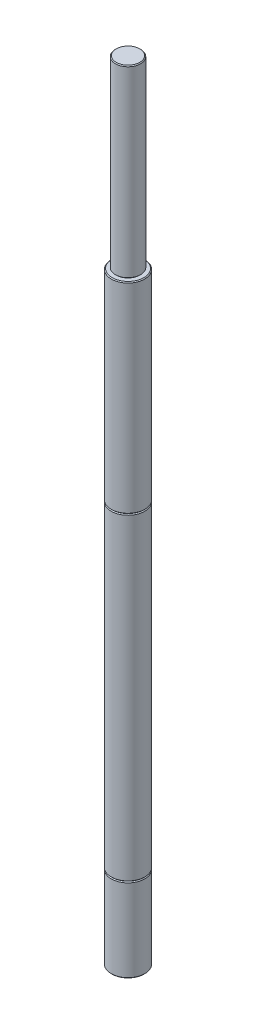
ISO-10303-21;
HEADER;
FILE_DESCRIPTION(('STEP AP214'),'2;1');
FILE_NAME('part.step','',(''),(''),'','','');
FILE_SCHEMA(('AUTOMOTIVE_DESIGN { 1 0 10303 214 1 1 1 1 }'));
ENDSEC;
DATA;
#1=APPLICATION_CONTEXT('core data for automotive mechanical design processes');
#2=APPLICATION_PROTOCOL_DEFINITION('international standard','automotive_design',2000,#1);
#3=PRODUCT_CONTEXT('',#1,'mechanical');
#4=PRODUCT('Part','Part','',(#3));
#5=PRODUCT_RELATED_PRODUCT_CATEGORY('part','',(#4));
#6=PRODUCT_DEFINITION_FORMATION('','',#4);
#7=PRODUCT_DEFINITION_CONTEXT('part definition',#1,'design');
#8=PRODUCT_DEFINITION('design','',#6,#7);
#9=PRODUCT_DEFINITION_SHAPE('','',#8);
#10=(LENGTH_UNIT() NAMED_UNIT(*) SI_UNIT(.MILLI.,.METRE.));
#11=(NAMED_UNIT(*) PLANE_ANGLE_UNIT() SI_UNIT($,.RADIAN.));
#12=(NAMED_UNIT(*) SI_UNIT($,.STERADIAN.) SOLID_ANGLE_UNIT());
#13=UNCERTAINTY_MEASURE_WITH_UNIT(LENGTH_MEASURE(1.E-05),#10,'distance_accuracy_value','');
#14=(GEOMETRIC_REPRESENTATION_CONTEXT(3) GLOBAL_UNCERTAINTY_ASSIGNED_CONTEXT((#13)) GLOBAL_UNIT_ASSIGNED_CONTEXT((#10,
#11,#12)) REPRESENTATION_CONTEXT('',''));
#15=CARTESIAN_POINT('',(0.,0.,0.));
#16=DIRECTION('',(0.,0.,1.));
#17=DIRECTION('',(1.,0.,0.));
#18=AXIS2_PLACEMENT_3D('',#15,#16,#17);
#19=CARTESIAN_POINT('',(0.,-72.,0.));
#20=DIRECTION('',(0.,1.,0.));
#21=DIRECTION('',(0.,0.,1.));
#22=AXIS2_PLACEMENT_3D('',#19,#20,#21);
#23=CYLINDRICAL_SURFACE('',#22,2.);
#24=CARTESIAN_POINT('',(0.,-62.1,0.));
#25=DIRECTION('',(0.,-1.,0.));
#26=DIRECTION('',(0.,0.,-1.));
#27=AXIS2_PLACEMENT_3D('',#24,#25,#26);
#28=CIRCLE('',#27,2.);
#29=CARTESIAN_POINT('',(0.,-62.1,-2.));
#30=VERTEX_POINT('',#29);
#31=EDGE_CURVE('E64',#30,#30,#28,.T.);
#32=ORIENTED_EDGE('',*,*,#31,.T.);
#33=EDGE_LOOP('',(#32));
#34=FACE_BOUND('',#33,.T.);
#35=CARTESIAN_POINT('',(0.,-71.9,0.));
#36=DIRECTION('',(0.,-1.,0.));
#37=DIRECTION('',(0.,0.,-1.));
#38=AXIS2_PLACEMENT_3D('',#35,#36,#37);
#39=CIRCLE('',#38,2.);
#40=CARTESIAN_POINT('',(0.,-71.9,-2.));
#41=VERTEX_POINT('',#40);
#42=EDGE_CURVE('E68',#41,#41,#39,.F.);
#43=ORIENTED_EDGE('',*,*,#42,.T.);
#44=EDGE_LOOP('',(#43));
#45=FACE_BOUND('',#44,.T.);
#46=ADVANCED_FACE('F52',(#34,#45),#23,.T.);
#47=CARTESIAN_POINT('',(0.,-72.,0.));
#48=DIRECTION('',(0.,-1.,0.));
#49=DIRECTION('',(0.,0.,-1.));
#50=AXIS2_PLACEMENT_3D('',#47,#48,#49);
#51=PLANE('',#50);
#52=CARTESIAN_POINT('',(0.,-72.,0.));
#53=DIRECTION('',(0.,-1.,0.));
#54=DIRECTION('',(0.,0.,-1.));
#55=AXIS2_PLACEMENT_3D('',#52,#53,#54);
#56=CIRCLE('',#55,1.9);
#57=CARTESIAN_POINT('',(0.,-72.,-1.9));
#58=VERTEX_POINT('',#57);
#59=EDGE_CURVE('E11',#58,#58,#56,.T.);
#60=ORIENTED_EDGE('',*,*,#59,.T.);
#61=EDGE_LOOP('',(#60));
#62=FACE_BOUND('',#61,.T.);
#63=ADVANCED_FACE('F84',(#62),#51,.T.);
#64=CARTESIAN_POINT('',(0.,-62.,0.));
#65=DIRECTION('',(0.,-1.,0.));
#66=DIRECTION('',(0.,0.,-1.));
#67=AXIS2_PLACEMENT_3D('',#64,#65,#66);
#68=PLANE('',#67);
#69=CARTESIAN_POINT('',(0.,-62.,0.));
#70=DIRECTION('',(0.,-1.,0.));
#71=DIRECTION('',(0.,0.,-1.));
#72=AXIS2_PLACEMENT_3D('',#69,#70,#71);
#73=CIRCLE('',#72,1.9);
#74=CARTESIAN_POINT('',(0.,-62.,-1.9));
#75=VERTEX_POINT('',#74);
#76=EDGE_CURVE('E60',#75,#75,#73,.F.);
#77=ORIENTED_EDGE('',*,*,#76,.T.);
#78=EDGE_LOOP('',(#77));
#79=FACE_BOUND('',#78,.T.);
#80=ADVANCED_FACE('F81',(#79),#68,.F.);
#81=CARTESIAN_POINT('',(0.,-62.1,0.));
#82=DIRECTION('',(0.,-1.,0.));
#83=DIRECTION('',(0.,0.,-1.));
#84=AXIS2_PLACEMENT_3D('',#81,#82,#83);
#85=CONICAL_SURFACE('',#84,2.,0.785398163397444);
#86=ORIENTED_EDGE('',*,*,#76,.F.);
#87=EDGE_LOOP('',(#86));
#88=FACE_BOUND('',#87,.T.);
#89=ORIENTED_EDGE('',*,*,#31,.F.);
#90=EDGE_LOOP('',(#89));
#91=FACE_BOUND('',#90,.T.);
#92=ADVANCED_FACE('F77',(#88,#91),#85,.T.);
#93=CARTESIAN_POINT('',(0.,-72.,0.));
#94=DIRECTION('',(0.,1.,0.));
#95=DIRECTION('',(0.,0.,1.));
#96=AXIS2_PLACEMENT_3D('',#93,#94,#95);
#97=CONICAL_SURFACE('',#96,1.9,0.78539816339744);
#98=ORIENTED_EDGE('',*,*,#42,.F.);
#99=EDGE_LOOP('',(#98));
#100=FACE_BOUND('',#99,.T.);
#101=ORIENTED_EDGE('',*,*,#59,.F.);
#102=EDGE_LOOP('',(#101));
#103=FACE_BOUND('',#102,.T.);
#104=ADVANCED_FACE('F55',(#100,#103),#97,.T.);
#105=CLOSED_SHELL('',(#46,#63,#80,#92,#104));
#106=MANIFOLD_SOLID_BREP('B2',#105);
#107=CARTESIAN_POINT('',(0.,-62.,0.));
#108=DIRECTION('',(0.,1.,0.));
#109=DIRECTION('',(0.,0.,1.));
#110=AXIS2_PLACEMENT_3D('',#107,#108,#109);
#111=CYLINDRICAL_SURFACE('',#110,2.);
#112=CARTESIAN_POINT('',(0.,-24.1,0.));
#113=DIRECTION('',(0.,-1.,0.));
#114=DIRECTION('',(0.,0.,-1.));
#115=AXIS2_PLACEMENT_3D('',#112,#113,#114);
#116=CIRCLE('',#115,2.);
#117=CARTESIAN_POINT('',(0.,-24.1,-2.));
#118=VERTEX_POINT('',#117);
#119=EDGE_CURVE('E161',#118,#118,#116,.T.);
#120=ORIENTED_EDGE('',*,*,#119,.T.);
#121=EDGE_LOOP('',(#120));
#122=FACE_BOUND('',#121,.T.);
#123=CARTESIAN_POINT('',(0.,-61.9,0.));
#124=DIRECTION('',(0.,-1.,0.));
#125=DIRECTION('',(0.,0.,-1.));
#126=AXIS2_PLACEMENT_3D('',#123,#124,#125);
#127=CIRCLE('',#126,2.);
#128=CARTESIAN_POINT('',(0.,-61.9,-2.));
#129=VERTEX_POINT('',#128);
#130=EDGE_CURVE('E166',#129,#129,#127,.F.);
#131=ORIENTED_EDGE('',*,*,#130,.T.);
#132=EDGE_LOOP('',(#131));
#133=FACE_BOUND('',#132,.T.);
#134=ADVANCED_FACE('F147',(#122,#133),#111,.T.);
#135=CARTESIAN_POINT('',(0.,-62.,0.));
#136=DIRECTION('',(0.,-1.,0.));
#137=DIRECTION('',(0.,0.,-1.));
#138=AXIS2_PLACEMENT_3D('',#135,#136,#137);
#139=PLANE('',#138);
#140=CARTESIAN_POINT('',(0.,-62.,0.));
#141=DIRECTION('',(0.,-1.,0.));
#142=DIRECTION('',(0.,0.,-1.));
#143=AXIS2_PLACEMENT_3D('',#140,#141,#142);
#144=CIRCLE('',#143,1.9);
#145=CARTESIAN_POINT('',(0.,-62.,-1.9));
#146=VERTEX_POINT('',#145);
#147=EDGE_CURVE('E51',#146,#146,#144,.T.);
#148=ORIENTED_EDGE('',*,*,#147,.T.);
#149=EDGE_LOOP('',(#148));
#150=FACE_BOUND('',#149,.T.);
#151=ADVANCED_FACE('F183',(#150),#139,.T.);
#152=CARTESIAN_POINT('',(0.,-24.,0.));
#153=DIRECTION('',(0.,-1.,0.));
#154=DIRECTION('',(0.,0.,-1.));
#155=AXIS2_PLACEMENT_3D('',#152,#153,#154);
#156=PLANE('',#155);
#157=CARTESIAN_POINT('',(0.,-24.,0.));
#158=DIRECTION('',(0.,-1.,0.));
#159=DIRECTION('',(0.,0.,-1.));
#160=AXIS2_PLACEMENT_3D('',#157,#158,#159);
#161=CIRCLE('',#160,1.89999999999999);
#162=CARTESIAN_POINT('',(0.,-24.,-1.89999999999999));
#163=VERTEX_POINT('',#162);
#164=EDGE_CURVE('E156',#163,#163,#161,.F.);
#165=ORIENTED_EDGE('',*,*,#164,.T.);
#166=EDGE_LOOP('',(#165));
#167=FACE_BOUND('',#166,.T.);
#168=ADVANCED_FACE('F180',(#167),#156,.F.);
#169=CARTESIAN_POINT('',(0.,-24.1,0.));
#170=DIRECTION('',(0.,-1.,0.));
#171=DIRECTION('',(0.,0.,-1.));
#172=AXIS2_PLACEMENT_3D('',#169,#170,#171);
#173=CONICAL_SURFACE('',#172,2.,0.78539816339744);
#174=ORIENTED_EDGE('',*,*,#164,.F.);
#175=EDGE_LOOP('',(#174));
#176=FACE_BOUND('',#175,.T.);
#177=ORIENTED_EDGE('',*,*,#119,.F.);
#178=EDGE_LOOP('',(#177));
#179=FACE_BOUND('',#178,.T.);
#180=ADVANCED_FACE('F176',(#176,#179),#173,.T.);
#181=CARTESIAN_POINT('',(0.,-62.,0.));
#182=DIRECTION('',(0.,1.,0.));
#183=DIRECTION('',(0.,0.,1.));
#184=AXIS2_PLACEMENT_3D('',#181,#182,#183);
#185=CONICAL_SURFACE('',#184,1.9,0.785398163397492);
#186=ORIENTED_EDGE('',*,*,#130,.F.);
#187=EDGE_LOOP('',(#186));
#188=FACE_BOUND('',#187,.T.);
#189=ORIENTED_EDGE('',*,*,#147,.F.);
#190=EDGE_LOOP('',(#189));
#191=FACE_BOUND('',#190,.T.);
#192=ADVANCED_FACE('F150',(#188,#191),#185,.T.);
#193=CLOSED_SHELL('',(#134,#151,#168,#180,#192));
#194=MANIFOLD_SOLID_BREP('B6',#193);
#195=CARTESIAN_POINT('',(0.,-24.,0.));
#196=DIRECTION('',(0.,1.,0.));
#197=DIRECTION('',(0.,0.,1.));
#198=AXIS2_PLACEMENT_3D('',#195,#196,#197);
#199=CYLINDRICAL_SURFACE('',#198,2.);
#200=CARTESIAN_POINT('',(0.,-0.100000000000003,0.));
#201=DIRECTION('',(0.,-1.,0.));
#202=DIRECTION('',(0.,0.,-1.));
#203=AXIS2_PLACEMENT_3D('',#200,#201,#202);
#204=CIRCLE('',#203,2.);
#205=CARTESIAN_POINT('',(0.,-0.100000000000003,-2.));
#206=VERTEX_POINT('',#205);
#207=EDGE_CURVE('E257',#206,#206,#204,.T.);
#208=ORIENTED_EDGE('',*,*,#207,.T.);
#209=EDGE_LOOP('',(#208));
#210=FACE_BOUND('',#209,.T.);
#211=CARTESIAN_POINT('',(0.,-23.9,0.));
#212=DIRECTION('',(0.,-1.,0.));
#213=DIRECTION('',(0.,0.,-1.));
#214=AXIS2_PLACEMENT_3D('',#211,#212,#213);
#215=CIRCLE('',#214,2.);
#216=CARTESIAN_POINT('',(0.,-23.9,-2.));
#217=VERTEX_POINT('',#216);
#218=EDGE_CURVE('E261',#217,#217,#215,.F.);
#219=ORIENTED_EDGE('',*,*,#218,.T.);
#220=EDGE_LOOP('',(#219));
#221=FACE_BOUND('',#220,.T.);
#222=ADVANCED_FACE('F245',(#210,#221),#199,.T.);
#223=CARTESIAN_POINT('',(0.,-24.,0.));
#224=DIRECTION('',(0.,-1.,0.));
#225=DIRECTION('',(0.,0.,-1.));
#226=AXIS2_PLACEMENT_3D('',#223,#224,#225);
#227=PLANE('',#226);
#228=CARTESIAN_POINT('',(0.,-24.,0.));
#229=DIRECTION('',(0.,-1.,0.));
#230=DIRECTION('',(0.,0.,-1.));
#231=AXIS2_PLACEMENT_3D('',#228,#229,#230);
#232=CIRCLE('',#231,1.9);
#233=CARTESIAN_POINT('',(0.,-24.,-1.9));
#234=VERTEX_POINT('',#233);
#235=EDGE_CURVE('E146',#234,#234,#232,.T.);
#236=ORIENTED_EDGE('',*,*,#235,.T.);
#237=EDGE_LOOP('',(#236));
#238=FACE_BOUND('',#237,.T.);
#239=ADVANCED_FACE('F277',(#238),#227,.T.);
#240=CARTESIAN_POINT('',(0.,0.,0.));
#241=DIRECTION('',(0.,-1.,0.));
#242=DIRECTION('',(0.,0.,-1.));
#243=AXIS2_PLACEMENT_3D('',#240,#241,#242);
#244=PLANE('',#243);
#245=CARTESIAN_POINT('',(0.,0.,0.));
#246=DIRECTION('',(0.,-1.,0.));
#247=DIRECTION('',(0.,0.,-1.));
#248=AXIS2_PLACEMENT_3D('',#245,#246,#247);
#249=CIRCLE('',#248,1.9);
#250=CARTESIAN_POINT('',(0.,0.,-1.9));
#251=VERTEX_POINT('',#250);
#252=EDGE_CURVE('E253',#251,#251,#249,.F.);
#253=ORIENTED_EDGE('',*,*,#252,.T.);
#254=EDGE_LOOP('',(#253));
#255=FACE_BOUND('',#254,.T.);
#256=ADVANCED_FACE('F274',(#255),#244,.F.);
#257=CARTESIAN_POINT('',(0.,-0.100000000000003,0.));
#258=DIRECTION('',(0.,-1.,0.));
#259=DIRECTION('',(0.,0.,-1.));
#260=AXIS2_PLACEMENT_3D('',#257,#258,#259);
#261=CONICAL_SURFACE('',#260,2.,0.785398163397431);
#262=ORIENTED_EDGE('',*,*,#252,.F.);
#263=EDGE_LOOP('',(#262));
#264=FACE_BOUND('',#263,.T.);
#265=ORIENTED_EDGE('',*,*,#207,.F.);
#266=EDGE_LOOP('',(#265));
#267=FACE_BOUND('',#266,.T.);
#268=ADVANCED_FACE('F270',(#264,#267),#261,.T.);
#269=CARTESIAN_POINT('',(0.,-24.,0.));
#270=DIRECTION('',(0.,1.,0.));
#271=DIRECTION('',(0.,0.,1.));
#272=AXIS2_PLACEMENT_3D('',#269,#270,#271);
#273=CONICAL_SURFACE('',#272,1.9,0.785398163397457);
#274=ORIENTED_EDGE('',*,*,#218,.F.);
#275=EDGE_LOOP('',(#274));
#276=FACE_BOUND('',#275,.T.);
#277=ORIENTED_EDGE('',*,*,#235,.F.);
#278=EDGE_LOOP('',(#277));
#279=FACE_BOUND('',#278,.T.);
#280=ADVANCED_FACE('F248',(#276,#279),#273,.T.);
#281=CLOSED_SHELL('',(#222,#239,#256,#268,#280));
#282=MANIFOLD_SOLID_BREP('B46',#281);
#283=CARTESIAN_POINT('',(0.,22.,0.));
#284=DIRECTION('',(0.,-1.,0.));
#285=DIRECTION('',(0.,0.,-1.));
#286=AXIS2_PLACEMENT_3D('',#283,#284,#285);
#287=CYLINDRICAL_SURFACE('',#286,1.5);
#288=CARTESIAN_POINT('',(0.,0.100000000000003,0.));
#289=DIRECTION('',(0.,1.,0.));
#290=DIRECTION('',(0.,0.,1.));
#291=AXIS2_PLACEMENT_3D('',#288,#289,#290);
#292=CIRCLE('',#291,1.5);
#293=CARTESIAN_POINT('',(0.,0.100000000000003,1.5));
#294=VERTEX_POINT('',#293);
#295=EDGE_CURVE('E344',#294,#294,#292,.T.);
#296=ORIENTED_EDGE('',*,*,#295,.T.);
#297=EDGE_LOOP('',(#296));
#298=FACE_BOUND('',#297,.T.);
#299=CARTESIAN_POINT('',(0.,21.9,0.));
#300=DIRECTION('',(0.,1.,0.));
#301=DIRECTION('',(0.,0.,1.));
#302=AXIS2_PLACEMENT_3D('',#299,#300,#301);
#303=CIRCLE('',#302,1.5);
#304=CARTESIAN_POINT('',(0.,21.9,1.5));
#305=VERTEX_POINT('',#304);
#306=EDGE_CURVE('E348',#305,#305,#303,.F.);
#307=ORIENTED_EDGE('',*,*,#306,.T.);
#308=EDGE_LOOP('',(#307));
#309=FACE_BOUND('',#308,.T.);
#310=ADVANCED_FACE('F332',(#298,#309),#287,.T.);
#311=CARTESIAN_POINT('',(0.,22.,0.));
#312=DIRECTION('',(0.,1.,0.));
#313=DIRECTION('',(0.,0.,1.));
#314=AXIS2_PLACEMENT_3D('',#311,#312,#313);
#315=PLANE('',#314);
#316=CARTESIAN_POINT('',(0.,22.,0.));
#317=DIRECTION('',(0.,1.,0.));
#318=DIRECTION('',(0.,0.,1.));
#319=AXIS2_PLACEMENT_3D('',#316,#317,#318);
#320=CIRCLE('',#319,1.40000000000001);
#321=CARTESIAN_POINT('',(0.,22.,1.40000000000001));
#322=VERTEX_POINT('',#321);
#323=EDGE_CURVE('E244',#322,#322,#320,.T.);
#324=ORIENTED_EDGE('',*,*,#323,.T.);
#325=EDGE_LOOP('',(#324));
#326=FACE_BOUND('',#325,.T.);
#327=ADVANCED_FACE('F364',(#326),#315,.T.);
#328=CARTESIAN_POINT('',(0.,0.,0.));
#329=DIRECTION('',(0.,1.,0.));
#330=DIRECTION('',(0.,0.,1.));
#331=AXIS2_PLACEMENT_3D('',#328,#329,#330);
#332=PLANE('',#331);
#333=CARTESIAN_POINT('',(0.,0.,0.));
#334=DIRECTION('',(0.,1.,0.));
#335=DIRECTION('',(0.,0.,1.));
#336=AXIS2_PLACEMENT_3D('',#333,#334,#335);
#337=CIRCLE('',#336,1.4);
#338=CARTESIAN_POINT('',(0.,0.,1.4));
#339=VERTEX_POINT('',#338);
#340=EDGE_CURVE('E340',#339,#339,#337,.F.);
#341=ORIENTED_EDGE('',*,*,#340,.T.);
#342=EDGE_LOOP('',(#341));
#343=FACE_BOUND('',#342,.T.);
#344=ADVANCED_FACE('F361',(#343),#332,.F.);
#345=CARTESIAN_POINT('',(0.,0.100000000000003,0.));
#346=DIRECTION('',(0.,1.,0.));
#347=DIRECTION('',(0.,0.,1.));
#348=AXIS2_PLACEMENT_3D('',#345,#346,#347);
#349=CONICAL_SURFACE('',#348,1.5,0.78539816339745);
#350=ORIENTED_EDGE('',*,*,#340,.F.);
#351=EDGE_LOOP('',(#350));
#352=FACE_BOUND('',#351,.T.);
#353=ORIENTED_EDGE('',*,*,#295,.F.);
#354=EDGE_LOOP('',(#353));
#355=FACE_BOUND('',#354,.T.);
#356=ADVANCED_FACE('F357',(#352,#355),#349,.T.);
#357=CARTESIAN_POINT('',(0.,22.,0.));
#358=DIRECTION('',(0.,-1.,0.));
#359=DIRECTION('',(0.,0.,-1.));
#360=AXIS2_PLACEMENT_3D('',#357,#358,#359);
#361=CONICAL_SURFACE('',#360,1.40000000000001,0.785398163397444);
#362=ORIENTED_EDGE('',*,*,#306,.F.);
#363=EDGE_LOOP('',(#362));
#364=FACE_BOUND('',#363,.T.);
#365=ORIENTED_EDGE('',*,*,#323,.F.);
#366=EDGE_LOOP('',(#365));
#367=FACE_BOUND('',#366,.T.);
#368=ADVANCED_FACE('F335',(#364,#367),#361,.T.);
#369=CLOSED_SHELL('',(#310,#327,#344,#356,#368));
#370=MANIFOLD_SOLID_BREP('B141',#369);
#371=ADVANCED_BREP_SHAPE_REPRESENTATION('',(#18,#106,#194,#282,#370),#14);
#372=SHAPE_DEFINITION_REPRESENTATION(#9,#371);
ENDSEC;
END-ISO-10303-21;
